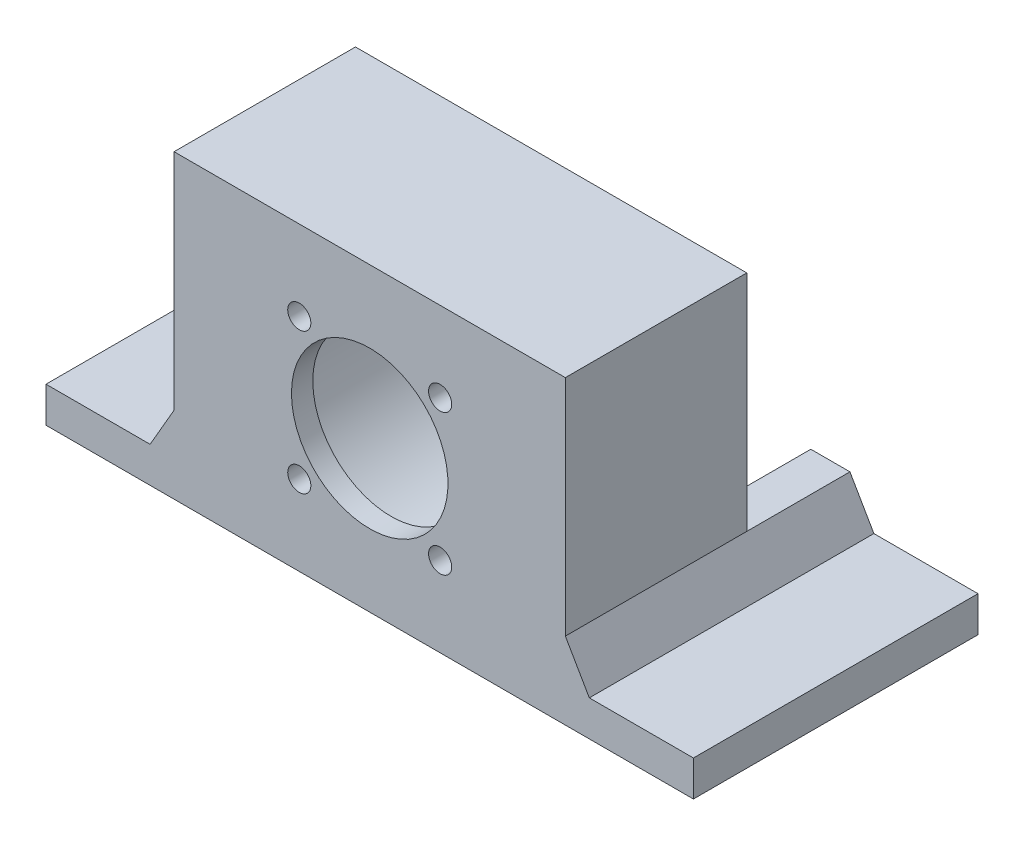
ISO-10303-21;
HEADER;
FILE_DESCRIPTION(('STEP AP214'),'2;1');
FILE_NAME('part.step','',(''),(''),'','','');
FILE_SCHEMA(('AUTOMOTIVE_DESIGN { 1 0 10303 214 1 1 1 1 }'));
ENDSEC;
DATA;
#1=APPLICATION_CONTEXT('core data for automotive mechanical design processes');
#2=APPLICATION_PROTOCOL_DEFINITION('international standard','automotive_design',2000,#1);
#3=PRODUCT_CONTEXT('',#1,'mechanical');
#4=PRODUCT('Part','Part','',(#3));
#5=PRODUCT_RELATED_PRODUCT_CATEGORY('part','',(#4));
#6=PRODUCT_DEFINITION_FORMATION('','',#4);
#7=PRODUCT_DEFINITION_CONTEXT('part definition',#1,'design');
#8=PRODUCT_DEFINITION('design','',#6,#7);
#9=PRODUCT_DEFINITION_SHAPE('','',#8);
#10=(LENGTH_UNIT() NAMED_UNIT(*) SI_UNIT(.MILLI.,.METRE.));
#11=(NAMED_UNIT(*) PLANE_ANGLE_UNIT() SI_UNIT($,.RADIAN.));
#12=(NAMED_UNIT(*) SI_UNIT($,.STERADIAN.) SOLID_ANGLE_UNIT());
#13=UNCERTAINTY_MEASURE_WITH_UNIT(LENGTH_MEASURE(1.E-05),#10,'distance_accuracy_value','');
#14=(GEOMETRIC_REPRESENTATION_CONTEXT(3) GLOBAL_UNCERTAINTY_ASSIGNED_CONTEXT((#13)) GLOBAL_UNIT_ASSIGNED_CONTEXT((#10,
#11,#12)) REPRESENTATION_CONTEXT('',''));
#15=CARTESIAN_POINT('',(0.,0.,0.));
#16=DIRECTION('',(0.,0.,1.));
#17=DIRECTION('',(1.,0.,0.));
#18=AXIS2_PLACEMENT_3D('',#15,#16,#17);
#19=CARTESIAN_POINT('',(0.,0.,0.));
#20=DIRECTION('',(0.,0.,-1.));
#21=DIRECTION('',(-1.,0.,0.));
#22=AXIS2_PLACEMENT_3D('',#19,#20,#21);
#23=PLANE('',#22);
#24=CARTESIAN_POINT('',(27.5,21.15,0.));
#25=DIRECTION('',(0.,0.,1.));
#26=DIRECTION('',(1.,0.,0.));
#27=AXIS2_PLACEMENT_3D('',#24,#25,#26);
#28=CIRCLE('',#27,18.1);
#29=CARTESIAN_POINT('',(45.6,21.15,0.));
#30=VERTEX_POINT('',#29);
#31=EDGE_CURVE('E305',#30,#30,#28,.T.);
#32=ORIENTED_EDGE('',*,*,#31,.T.);
#33=EDGE_LOOP('',(#32));
#34=FACE_BOUND('',#33,.T.);
#35=DIRECTION('',(1.,0.,0.));
#36=VECTOR('',#35,1.);
#37=CARTESIAN_POINT('',(0.,0.,0.));
#38=LINE('',#37,#36);
#39=CARTESIAN_POINT('',(5.5,0.,0.));
#40=VERTEX_POINT('',#39);
#41=CARTESIAN_POINT('',(49.5,0.,0.));
#42=VERTEX_POINT('',#41);
#43=EDGE_CURVE('E69',#40,#42,#38,.T.);
#44=ORIENTED_EDGE('',*,*,#43,.F.);
#45=DIRECTION('',(0.,-1.,0.));
#46=VECTOR('',#45,1.);
#47=CARTESIAN_POINT('',(5.5,10.8325274720935,0.));
#48=LINE('',#47,#46);
#49=CARTESIAN_POINT('',(5.5,10.8325274720935,0.));
#50=VERTEX_POINT('',#49);
#51=EDGE_CURVE('E64',#50,#40,#48,.T.);
#52=ORIENTED_EDGE('',*,*,#51,.F.);
#53=DIRECTION('',(1.,0.,0.));
#54=VECTOR('',#53,1.);
#55=CARTESIAN_POINT('',(0.,10.8325274720935,0.));
#56=LINE('',#55,#54);
#57=CARTESIAN_POINT('',(0.,10.8325274720935,0.));
#58=VERTEX_POINT('',#57);
#59=EDGE_CURVE('E173',#58,#50,#56,.T.);
#60=ORIENTED_EDGE('',*,*,#59,.F.);
#61=DIRECTION('',(0.,-1.,0.));
#62=VECTOR('',#61,1.);
#63=CARTESIAN_POINT('',(0.,0.,0.));
#64=LINE('',#63,#62);
#65=CARTESIAN_POINT('',(0.,42.3,0.));
#66=VERTEX_POINT('',#65);
#67=EDGE_CURVE('E314',#66,#58,#64,.T.);
#68=ORIENTED_EDGE('',*,*,#67,.F.);
#69=DIRECTION('',(-1.,0.,0.));
#70=VECTOR('',#69,1.);
#71=CARTESIAN_POINT('',(0.,42.3,0.));
#72=LINE('',#71,#70);
#73=CARTESIAN_POINT('',(55.,42.3,0.));
#74=VERTEX_POINT('',#73);
#75=EDGE_CURVE('E320',#74,#66,#72,.T.);
#76=ORIENTED_EDGE('',*,*,#75,.F.);
#77=DIRECTION('',(0.,1.,0.));
#78=VECTOR('',#77,1.);
#79=CARTESIAN_POINT('',(55.,0.,0.));
#80=LINE('',#79,#78);
#81=CARTESIAN_POINT('',(55.,10.8325274720935,0.));
#82=VERTEX_POINT('',#81);
#83=EDGE_CURVE('E335',#82,#74,#80,.T.);
#84=ORIENTED_EDGE('',*,*,#83,.F.);
#85=DIRECTION('',(1.,0.,0.));
#86=VECTOR('',#85,1.);
#87=CARTESIAN_POINT('',(55.,10.8325274720935,0.));
#88=LINE('',#87,#86);
#89=CARTESIAN_POINT('',(49.5,10.8325274720935,0.));
#90=VERTEX_POINT('',#89);
#91=EDGE_CURVE('E197',#90,#82,#88,.T.);
#92=ORIENTED_EDGE('',*,*,#91,.F.);
#93=DIRECTION('',(0.,1.,0.));
#94=VECTOR('',#93,1.);
#95=CARTESIAN_POINT('',(49.5,10.8325274720935,0.));
#96=LINE('',#95,#94);
#97=EDGE_CURVE('E193',#42,#90,#96,.T.);
#98=ORIENTED_EDGE('',*,*,#97,.F.);
#99=EDGE_LOOP('',(#44,#52,#60,#68,#76,#84,#92,#98));
#100=FACE_BOUND('',#99,.T.);
#101=ADVANCED_FACE('F45',(#34,#100),#23,.T.);
#102=CARTESIAN_POINT('',(55.,0.,25.5));
#103=DIRECTION('',(-1.,0.,0.));
#104=DIRECTION('',(0.,0.,1.));
#105=AXIS2_PLACEMENT_3D('',#102,#103,#104);
#106=PLANE('',#105);
#107=DIRECTION('',(0.,0.,1.));
#108=VECTOR('',#107,1.);
#109=CARTESIAN_POINT('',(55.,10.8325274720935,-14.5));
#110=LINE('',#109,#108);
#111=CARTESIAN_POINT('',(55.,10.8325274720935,25.5));
#112=VERTEX_POINT('',#111);
#113=EDGE_CURVE('E55',#82,#112,#110,.T.);
#114=ORIENTED_EDGE('',*,*,#113,.F.);
#115=ORIENTED_EDGE('',*,*,#83,.T.);
#116=DIRECTION('',(0.,0.,-1.));
#117=VECTOR('',#116,1.);
#118=CARTESIAN_POINT('',(55.,42.3,25.5));
#119=LINE('',#118,#117);
#120=CARTESIAN_POINT('',(55.,42.3,25.5));
#121=VERTEX_POINT('',#120);
#122=EDGE_CURVE('E343',#121,#74,#119,.T.);
#123=ORIENTED_EDGE('',*,*,#122,.F.);
#124=DIRECTION('',(0.,1.,0.));
#125=VECTOR('',#124,1.);
#126=CARTESIAN_POINT('',(55.,0.,25.5));
#127=LINE('',#126,#125);
#128=EDGE_CURVE('E323',#112,#121,#127,.T.);
#129=ORIENTED_EDGE('',*,*,#128,.F.);
#130=EDGE_LOOP('',(#114,#115,#123,#129));
#131=FACE_BOUND('',#130,.T.);
#132=ADVANCED_FACE('F421',(#131),#106,.F.);
#133=CARTESIAN_POINT('',(0.,0.,25.5));
#134=DIRECTION('',(1.,0.,0.));
#135=DIRECTION('',(0.,0.,-1.));
#136=AXIS2_PLACEMENT_3D('',#133,#134,#135);
#137=PLANE('',#136);
#138=ORIENTED_EDGE('',*,*,#67,.T.);
#139=DIRECTION('',(0.,0.,1.));
#140=VECTOR('',#139,1.);
#141=CARTESIAN_POINT('',(0.,10.8325274720935,-14.5));
#142=LINE('',#141,#140);
#143=CARTESIAN_POINT('',(0.,10.8325274720935,25.5));
#144=VERTEX_POINT('',#143);
#145=EDGE_CURVE('E12',#58,#144,#142,.T.);
#146=ORIENTED_EDGE('',*,*,#145,.T.);
#147=DIRECTION('',(0.,-1.,0.));
#148=VECTOR('',#147,1.);
#149=CARTESIAN_POINT('',(0.,0.,25.5));
#150=LINE('',#149,#148);
#151=CARTESIAN_POINT('',(0.,42.3,25.5));
#152=VERTEX_POINT('',#151);
#153=EDGE_CURVE('E315',#152,#144,#150,.T.);
#154=ORIENTED_EDGE('',*,*,#153,.F.);
#155=DIRECTION('',(0.,0.,-1.));
#156=VECTOR('',#155,1.);
#157=CARTESIAN_POINT('',(0.,42.3,25.5));
#158=LINE('',#157,#156);
#159=EDGE_CURVE('E329',#152,#66,#158,.T.);
#160=ORIENTED_EDGE('',*,*,#159,.T.);
#161=EDGE_LOOP('',(#138,#146,#154,#160));
#162=FACE_BOUND('',#161,.T.);
#163=ADVANCED_FACE('F47',(#162),#137,.F.);
#164=CARTESIAN_POINT('',(0.,0.,25.5));
#165=DIRECTION('',(0.,1.,0.));
#166=DIRECTION('',(0.,0.,1.));
#167=AXIS2_PLACEMENT_3D('',#164,#165,#166);
#168=PLANE('',#167);
#169=DIRECTION('',(0.,0.,1.));
#170=VECTOR('',#169,1.);
#171=CARTESIAN_POINT('',(5.5,0.,-26.6488127581942));
#172=LINE('',#171,#170);
#173=CARTESIAN_POINT('',(5.5,0.,-14.5));
#174=VERTEX_POINT('',#173);
#175=EDGE_CURVE('E176',#174,#40,#172,.T.);
#176=ORIENTED_EDGE('',*,*,#175,.T.);
#177=ORIENTED_EDGE('',*,*,#43,.T.);
#178=DIRECTION('',(0.,0.,1.));
#179=VECTOR('',#178,1.);
#180=CARTESIAN_POINT('',(49.5,0.,-26.6488127581942));
#181=LINE('',#180,#179);
#182=CARTESIAN_POINT('',(49.5,0.,-14.5));
#183=VERTEX_POINT('',#182);
#184=EDGE_CURVE('E188',#183,#42,#181,.T.);
#185=ORIENTED_EDGE('',*,*,#184,.F.);
#186=DIRECTION('',(1.,0.,0.));
#187=VECTOR('',#186,1.);
#188=CARTESIAN_POINT('',(55.,0.,-14.5));
#189=LINE('',#188,#187);
#190=CARTESIAN_POINT('',(73.,0.,-14.5));
#191=VERTEX_POINT('',#190);
#192=EDGE_CURVE('E244',#183,#191,#189,.T.);
#193=ORIENTED_EDGE('',*,*,#192,.T.);
#194=DIRECTION('',(0.,0.,1.));
#195=VECTOR('',#194,1.);
#196=CARTESIAN_POINT('',(73.,0.,-14.5));
#197=LINE('',#196,#195);
#198=CARTESIAN_POINT('',(73.,0.,25.5));
#199=VERTEX_POINT('',#198);
#200=EDGE_CURVE('E260',#191,#199,#197,.T.);
#201=ORIENTED_EDGE('',*,*,#200,.T.);
#202=DIRECTION('',(1.,0.,0.));
#203=VECTOR('',#202,1.);
#204=CARTESIAN_POINT('',(0.,0.,25.5));
#205=LINE('',#204,#203);
#206=CARTESIAN_POINT('',(-18.,0.,25.5));
#207=VERTEX_POINT('',#206);
#208=EDGE_CURVE('E319',#207,#199,#205,.T.);
#209=ORIENTED_EDGE('',*,*,#208,.F.);
#210=DIRECTION('',(0.,0.,1.));
#211=VECTOR('',#210,1.);
#212=CARTESIAN_POINT('',(-18.,0.,-14.5));
#213=LINE('',#212,#211);
#214=CARTESIAN_POINT('',(-18.,0.,-14.5));
#215=VERTEX_POINT('',#214);
#216=EDGE_CURVE('E192',#215,#207,#213,.T.);
#217=ORIENTED_EDGE('',*,*,#216,.F.);
#218=DIRECTION('',(1.,0.,0.));
#219=VECTOR('',#218,1.);
#220=CARTESIAN_POINT('',(0.,0.,-14.5));
#221=LINE('',#220,#219);
#222=EDGE_CURVE('E224',#215,#174,#221,.T.);
#223=ORIENTED_EDGE('',*,*,#222,.T.);
#224=EDGE_LOOP('',(#176,#177,#185,#193,#201,#209,#217,#223));
#225=FACE_BOUND('',#224,.T.);
#226=ADVANCED_FACE('F405',(#225),#168,.F.);
#227=CARTESIAN_POINT('',(0.,42.3,25.5));
#228=DIRECTION('',(0.,-1.,0.));
#229=DIRECTION('',(0.,0.,-1.));
#230=AXIS2_PLACEMENT_3D('',#227,#228,#229);
#231=PLANE('',#230);
#232=ORIENTED_EDGE('',*,*,#75,.T.);
#233=ORIENTED_EDGE('',*,*,#159,.F.);
#234=DIRECTION('',(-1.,0.,0.));
#235=VECTOR('',#234,1.);
#236=CARTESIAN_POINT('',(0.,42.3,25.5));
#237=LINE('',#236,#235);
#238=EDGE_CURVE('E326',#121,#152,#237,.T.);
#239=ORIENTED_EDGE('',*,*,#238,.F.);
#240=ORIENTED_EDGE('',*,*,#122,.T.);
#241=EDGE_LOOP('',(#232,#233,#239,#240));
#242=FACE_BOUND('',#241,.T.);
#243=ADVANCED_FACE('F379',(#242),#231,.F.);
#244=CARTESIAN_POINT('',(0.,0.,25.5));
#245=DIRECTION('',(0.,0.,-1.));
#246=DIRECTION('',(-1.,0.,0.));
#247=AXIS2_PLACEMENT_3D('',#244,#245,#246);
#248=PLANE('',#247);
#249=CARTESIAN_POINT('',(37.3994949366116,11.2505050633883,25.5));
#250=DIRECTION('',(0.,0.,-1.));
#251=DIRECTION('',(-1.,0.,0.));
#252=AXIS2_PLACEMENT_3D('',#249,#250,#251);
#253=CIRCLE('',#252,1.62500000000006);
#254=CARTESIAN_POINT('',(35.7744949366116,11.2505050633883,25.5));
#255=VERTEX_POINT('',#254);
#256=EDGE_CURVE('E275',#255,#255,#253,.T.);
#257=ORIENTED_EDGE('',*,*,#256,.T.);
#258=EDGE_LOOP('',(#257));
#259=FACE_BOUND('',#258,.T.);
#260=CARTESIAN_POINT('',(17.6005050633883,11.2505050633884,25.5));
#261=DIRECTION('',(0.,0.,-1.));
#262=DIRECTION('',(-1.,0.,0.));
#263=AXIS2_PLACEMENT_3D('',#260,#261,#262);
#264=CIRCLE('',#263,1.62500000000001);
#265=CARTESIAN_POINT('',(15.9755050633883,11.2505050633884,25.5));
#266=VERTEX_POINT('',#265);
#267=EDGE_CURVE('E290',#266,#266,#264,.T.);
#268=ORIENTED_EDGE('',*,*,#267,.T.);
#269=EDGE_LOOP('',(#268));
#270=FACE_BOUND('',#269,.T.);
#271=CARTESIAN_POINT('',(17.6005050633884,31.0494949366117,25.5));
#272=DIRECTION('',(0.,0.,-1.));
#273=DIRECTION('',(-1.,0.,0.));
#274=AXIS2_PLACEMENT_3D('',#271,#272,#273);
#275=CIRCLE('',#274,1.62500000000001);
#276=CARTESIAN_POINT('',(15.9755050633884,31.0494949366117,25.5));
#277=VERTEX_POINT('',#276);
#278=EDGE_CURVE('E285',#277,#277,#275,.T.);
#279=ORIENTED_EDGE('',*,*,#278,.T.);
#280=EDGE_LOOP('',(#279));
#281=FACE_BOUND('',#280,.T.);
#282=CARTESIAN_POINT('',(37.3994949366117,31.0494949366116,25.5));
#283=DIRECTION('',(0.,0.,-1.));
#284=DIRECTION('',(-1.,0.,0.));
#285=AXIS2_PLACEMENT_3D('',#282,#283,#284);
#286=CIRCLE('',#285,1.62500000000001);
#287=CARTESIAN_POINT('',(35.7744949366117,31.0494949366116,25.5));
#288=VERTEX_POINT('',#287);
#289=EDGE_CURVE('E289',#288,#288,#286,.T.);
#290=ORIENTED_EDGE('',*,*,#289,.T.);
#291=EDGE_LOOP('',(#290));
#292=FACE_BOUND('',#291,.T.);
#293=CARTESIAN_POINT('',(27.5,21.15,25.5));
#294=DIRECTION('',(0.,0.,-1.));
#295=DIRECTION('',(-1.,0.,0.));
#296=AXIS2_PLACEMENT_3D('',#293,#294,#295);
#297=CIRCLE('',#296,11.);
#298=CARTESIAN_POINT('',(16.5,21.15,25.5));
#299=VERTEX_POINT('',#298);
#300=EDGE_CURVE('E301',#299,#299,#297,.T.);
#301=ORIENTED_EDGE('',*,*,#300,.T.);
#302=EDGE_LOOP('',(#301));
#303=FACE_BOUND('',#302,.T.);
#304=ORIENTED_EDGE('',*,*,#153,.T.);
#305=DIRECTION('',(-0.500000000000001,-0.866025403784438,0.));
#306=VECTOR('',#305,1.);
#307=CARTESIAN_POINT('',(0.,10.8325274720935,25.5));
#308=LINE('',#307,#306);
#309=CARTESIAN_POINT('',(-3.3674113060691,5.,25.5));
#310=VERTEX_POINT('',#309);
#311=EDGE_CURVE('E228',#144,#310,#308,.T.);
#312=ORIENTED_EDGE('',*,*,#311,.T.);
#313=DIRECTION('',(-1.,0.,0.));
#314=VECTOR('',#313,1.);
#315=CARTESIAN_POINT('',(-18.,5.,25.5));
#316=LINE('',#315,#314);
#317=CARTESIAN_POINT('',(-18.,5.,25.5));
#318=VERTEX_POINT('',#317);
#319=EDGE_CURVE('E223',#310,#318,#316,.T.);
#320=ORIENTED_EDGE('',*,*,#319,.T.);
#321=DIRECTION('',(0.,-1.,0.));
#322=VECTOR('',#321,1.);
#323=CARTESIAN_POINT('',(-18.,0.,25.5));
#324=LINE('',#323,#322);
#325=EDGE_CURVE('E219',#318,#207,#324,.T.);
#326=ORIENTED_EDGE('',*,*,#325,.T.);
#327=ORIENTED_EDGE('',*,*,#208,.T.);
#328=DIRECTION('',(0.,1.,0.));
#329=VECTOR('',#328,1.);
#330=CARTESIAN_POINT('',(73.,0.,25.5));
#331=LINE('',#330,#329);
#332=CARTESIAN_POINT('',(73.,5.,25.5));
#333=VERTEX_POINT('',#332);
#334=EDGE_CURVE('E232',#199,#333,#331,.T.);
#335=ORIENTED_EDGE('',*,*,#334,.T.);
#336=DIRECTION('',(-1.,0.,0.));
#337=VECTOR('',#336,1.);
#338=CARTESIAN_POINT('',(73.,5.,25.5));
#339=LINE('',#338,#337);
#340=CARTESIAN_POINT('',(58.3674113060691,5.,25.5));
#341=VERTEX_POINT('',#340);
#342=EDGE_CURVE('E264',#333,#341,#339,.T.);
#343=ORIENTED_EDGE('',*,*,#342,.T.);
#344=DIRECTION('',(-0.500000000000001,0.866025403784438,0.));
#345=VECTOR('',#344,1.);
#346=CARTESIAN_POINT('',(55.,10.8325274720935,25.5));
#347=LINE('',#346,#345);
#348=EDGE_CURVE('E249',#341,#112,#347,.T.);
#349=ORIENTED_EDGE('',*,*,#348,.T.);
#350=ORIENTED_EDGE('',*,*,#128,.T.);
#351=ORIENTED_EDGE('',*,*,#238,.T.);
#352=EDGE_LOOP('',(#304,#312,#320,#326,#327,#335,#343,#349,#350,#351));
#353=FACE_BOUND('',#352,.T.);
#354=ADVANCED_FACE('F375',(#259,#270,#281,#292,#303,#353),#248,.F.);
#355=CARTESIAN_POINT('',(27.5,21.15,76.6945309579061));
#356=DIRECTION('',(0.,0.,-1.));
#357=DIRECTION('',(-1.,0.,0.));
#358=AXIS2_PLACEMENT_3D('',#355,#356,#357);
#359=CYLINDRICAL_SURFACE('',#358,18.1);
#360=CARTESIAN_POINT('',(27.5,21.15,22.5));
#361=DIRECTION('',(0.,0.,-1.));
#362=DIRECTION('',(-1.,0.,0.));
#363=AXIS2_PLACEMENT_3D('',#360,#361,#362);
#364=CIRCLE('',#363,18.1);
#365=CARTESIAN_POINT('',(9.4,21.15,22.5));
#366=VERTEX_POINT('',#365);
#367=EDGE_CURVE('E310',#366,#366,#364,.T.);
#368=ORIENTED_EDGE('',*,*,#367,.F.);
#369=EDGE_LOOP('',(#368));
#370=FACE_BOUND('',#369,.T.);
#371=ORIENTED_EDGE('',*,*,#31,.F.);
#372=EDGE_LOOP('',(#371));
#373=FACE_BOUND('',#372,.T.);
#374=ADVANCED_FACE('F378',(#370,#373),#359,.F.);
#375=CARTESIAN_POINT('',(0.,0.,22.5));
#376=DIRECTION('',(0.,0.,-1.));
#377=DIRECTION('',(-1.,0.,0.));
#378=AXIS2_PLACEMENT_3D('',#375,#376,#377);
#379=PLANE('',#378);
#380=CARTESIAN_POINT('',(37.3994949366116,11.2505050633883,22.5));
#381=DIRECTION('',(0.,0.,-1.));
#382=DIRECTION('',(-1.,0.,0.));
#383=AXIS2_PLACEMENT_3D('',#380,#381,#382);
#384=CIRCLE('',#383,1.62500000000006);
#385=CARTESIAN_POINT('',(35.7744949366116,11.2505050633883,22.5));
#386=VERTEX_POINT('',#385);
#387=EDGE_CURVE('E49',#386,#386,#384,.F.);
#388=ORIENTED_EDGE('',*,*,#387,.T.);
#389=EDGE_LOOP('',(#388));
#390=FACE_BOUND('',#389,.T.);
#391=CARTESIAN_POINT('',(17.6005050633883,11.2505050633884,22.5));
#392=DIRECTION('',(0.,0.,-1.));
#393=DIRECTION('',(-1.,0.,0.));
#394=AXIS2_PLACEMENT_3D('',#391,#392,#393);
#395=CIRCLE('',#394,1.62500000000001);
#396=CARTESIAN_POINT('',(15.9755050633883,11.2505050633884,22.5));
#397=VERTEX_POINT('',#396);
#398=EDGE_CURVE('E356',#397,#397,#395,.F.);
#399=ORIENTED_EDGE('',*,*,#398,.T.);
#400=EDGE_LOOP('',(#399));
#401=FACE_BOUND('',#400,.T.);
#402=CARTESIAN_POINT('',(17.6005050633884,31.0494949366117,22.5));
#403=DIRECTION('',(0.,0.,-1.));
#404=DIRECTION('',(-1.,0.,0.));
#405=AXIS2_PLACEMENT_3D('',#402,#403,#404);
#406=CIRCLE('',#405,1.62500000000001);
#407=CARTESIAN_POINT('',(15.9755050633884,31.0494949366117,22.5));
#408=VERTEX_POINT('',#407);
#409=EDGE_CURVE('E353',#408,#408,#406,.F.);
#410=ORIENTED_EDGE('',*,*,#409,.T.);
#411=EDGE_LOOP('',(#410));
#412=FACE_BOUND('',#411,.T.);
#413=CARTESIAN_POINT('',(37.3994949366117,31.0494949366116,22.5));
#414=DIRECTION('',(0.,0.,-1.));
#415=DIRECTION('',(-1.,0.,0.));
#416=AXIS2_PLACEMENT_3D('',#413,#414,#415);
#417=CIRCLE('',#416,1.62500000000001);
#418=CARTESIAN_POINT('',(35.7744949366117,31.0494949366116,22.5));
#419=VERTEX_POINT('',#418);
#420=EDGE_CURVE('E300',#419,#419,#417,.F.);
#421=ORIENTED_EDGE('',*,*,#420,.T.);
#422=EDGE_LOOP('',(#421));
#423=FACE_BOUND('',#422,.T.);
#424=CARTESIAN_POINT('',(27.5,21.15,22.5));
#425=DIRECTION('',(0.,0.,-1.));
#426=DIRECTION('',(-1.,0.,0.));
#427=AXIS2_PLACEMENT_3D('',#424,#425,#426);
#428=CIRCLE('',#427,11.);
#429=CARTESIAN_POINT('',(16.5,21.15,22.5));
#430=VERTEX_POINT('',#429);
#431=EDGE_CURVE('E306',#430,#430,#428,.T.);
#432=ORIENTED_EDGE('',*,*,#431,.F.);
#433=EDGE_LOOP('',(#432));
#434=FACE_BOUND('',#433,.T.);
#435=ORIENTED_EDGE('',*,*,#367,.T.);
#436=EDGE_LOOP('',(#435));
#437=FACE_BOUND('',#436,.T.);
#438=ADVANCED_FACE('F365',(#390,#401,#412,#423,#434,#437),#379,.T.);
#439=CARTESIAN_POINT('',(27.5,21.15,25.500012));
#440=DIRECTION('',(0.,0.,-1.));
#441=DIRECTION('',(-1.,0.,0.));
#442=AXIS2_PLACEMENT_3D('',#439,#440,#441);
#443=CYLINDRICAL_SURFACE('',#442,11.);
#444=CARTESIAN_POINT('',(16.5,21.15,22.5));
#445=CARTESIAN_POINT('',(16.5,21.15,22.53125));
#446=CARTESIAN_POINT('',(16.5,21.15,22.5625));
#447=CARTESIAN_POINT('',(16.5,21.15,22.625));
#448=CARTESIAN_POINT('',(16.5,21.15,22.65625));
#449=CARTESIAN_POINT('',(16.5,21.15,22.71875));
#450=CARTESIAN_POINT('',(16.5,21.15,22.75));
#451=CARTESIAN_POINT('',(16.5,21.15,22.8125));
#452=CARTESIAN_POINT('',(16.5,21.15,22.84375));
#453=CARTESIAN_POINT('',(16.5,21.15,22.90625));
#454=CARTESIAN_POINT('',(16.5,21.15,22.9375));
#455=CARTESIAN_POINT('',(16.5,21.15,23.));
#456=CARTESIAN_POINT('',(16.5,21.15,23.03125));
#457=CARTESIAN_POINT('',(16.5,21.15,23.09375));
#458=CARTESIAN_POINT('',(16.5,21.15,23.125));
#459=CARTESIAN_POINT('',(16.5,21.15,23.1875));
#460=CARTESIAN_POINT('',(16.5,21.15,23.21875));
#461=CARTESIAN_POINT('',(16.5,21.15,23.28125));
#462=CARTESIAN_POINT('',(16.5,21.15,23.3125));
#463=CARTESIAN_POINT('',(16.5,21.15,23.375));
#464=CARTESIAN_POINT('',(16.5,21.15,23.40625));
#465=CARTESIAN_POINT('',(16.5,21.15,23.46875));
#466=CARTESIAN_POINT('',(16.5,21.15,23.5));
#467=CARTESIAN_POINT('',(16.5,21.15,23.5625));
#468=CARTESIAN_POINT('',(16.5,21.15,23.59375));
#469=CARTESIAN_POINT('',(16.5,21.15,23.65625));
#470=CARTESIAN_POINT('',(16.5,21.15,23.6875));
#471=CARTESIAN_POINT('',(16.5,21.15,23.75));
#472=CARTESIAN_POINT('',(16.5,21.15,23.78125));
#473=CARTESIAN_POINT('',(16.5,21.15,23.84375));
#474=CARTESIAN_POINT('',(16.5,21.15,23.875));
#475=CARTESIAN_POINT('',(16.5,21.15,23.9375));
#476=CARTESIAN_POINT('',(16.5,21.15,23.96875));
#477=CARTESIAN_POINT('',(16.5,21.15,24.03125));
#478=CARTESIAN_POINT('',(16.5,21.15,24.0625));
#479=CARTESIAN_POINT('',(16.5,21.15,24.125));
#480=CARTESIAN_POINT('',(16.5,21.15,24.15625));
#481=CARTESIAN_POINT('',(16.5,21.15,24.21875));
#482=CARTESIAN_POINT('',(16.5,21.15,24.25));
#483=CARTESIAN_POINT('',(16.5,21.15,24.3125));
#484=CARTESIAN_POINT('',(16.5,21.15,24.34375));
#485=CARTESIAN_POINT('',(16.5,21.15,24.40625));
#486=CARTESIAN_POINT('',(16.5,21.15,24.4375));
#487=CARTESIAN_POINT('',(16.5,21.15,24.5));
#488=CARTESIAN_POINT('',(16.5,21.15,24.53125));
#489=CARTESIAN_POINT('',(16.5,21.15,24.59375));
#490=CARTESIAN_POINT('',(16.5,21.15,24.625));
#491=CARTESIAN_POINT('',(16.5,21.15,24.6875));
#492=CARTESIAN_POINT('',(16.5,21.15,24.71875));
#493=CARTESIAN_POINT('',(16.5,21.15,24.78125));
#494=CARTESIAN_POINT('',(16.5,21.15,24.8125));
#495=CARTESIAN_POINT('',(16.5,21.15,24.875));
#496=CARTESIAN_POINT('',(16.5,21.15,24.90625));
#497=CARTESIAN_POINT('',(16.5,21.15,24.96875));
#498=CARTESIAN_POINT('',(16.5,21.15,25.));
#499=CARTESIAN_POINT('',(16.5,21.15,25.0625));
#500=CARTESIAN_POINT('',(16.5,21.15,25.09375));
#501=CARTESIAN_POINT('',(16.5,21.15,25.15625));
#502=CARTESIAN_POINT('',(16.5,21.15,25.1875));
#503=CARTESIAN_POINT('',(16.5,21.15,25.25));
#504=CARTESIAN_POINT('',(16.5,21.15,25.28125));
#505=CARTESIAN_POINT('',(16.5,21.15,25.34375));
#506=CARTESIAN_POINT('',(16.5,21.15,25.375));
#507=CARTESIAN_POINT('',(16.5,21.15,25.4375));
#508=CARTESIAN_POINT('',(16.5,21.15,25.46875));
#509=CARTESIAN_POINT('',(16.5,21.15,25.5));
#510=B_SPLINE_CURVE_WITH_KNOTS('',3,(#444,#445,#446,#447,#448,#449,#450,#451,#452,#453,#454,
#455,#456,#457,#458,#459,#460,#461,#462,#463,#464,#465,#466,#467,#468,#469,#470,#471,#472,#473,
#474,#475,#476,#477,#478,#479,#480,#481,#482,#483,#484,#485,#486,#487,#488,#489,#490,#491,#492,
#493,#494,#495,#496,#497,#498,#499,#500,#501,#502,#503,#504,#505,#506,#507,#508,#509),
.UNSPECIFIED.,.F.,.F.,(4,2,2,2,2,2,2,2,2,2,2,2,2,2,2,2,2,2,2,2,2,2,2,2,2,2,2,2,2,2,2,2,4),(0.,
0.0937500000000001,0.1875,0.28125,0.374999999999997,0.46875,0.562499999999997,0.656249999999997,
0.749999999999997,0.843749999999997,0.937499999999997,1.03125,1.125,1.21875,1.3125,1.40625,1.5,
1.59375,1.6875,1.78125,1.875,1.96875,2.0625,2.15625,2.25,2.34375,2.4375,2.53125,2.625,2.71875,
2.8125,2.90625,3.),.UNSPECIFIED.);
#511=EDGE_CURVE('BSEAM564',#430,#299,#510,.T.);
#512=ORIENTED_EDGE('',*,*,#431,.T.);
#513=ORIENTED_EDGE('',*,*,#300,.F.);
#514=ORIENTED_EDGE('',*,*,#511,.T.);
#515=ORIENTED_EDGE('',*,*,#511,.F.);
#516=EDGE_LOOP('',(#512,#514,#513,#515));
#517=FACE_BOUND('',#516,.T.);
#518=ADVANCED_FACE('F564',(#517),#443,.F.);
#519=CARTESIAN_POINT('',(37.3994949366117,31.0494949366116,15.5));
#520=DIRECTION('',(0.,0.,1.));
#521=DIRECTION('',(1.,0.,0.));
#522=AXIS2_PLACEMENT_3D('',#519,#520,#521);
#523=CYLINDRICAL_SURFACE('',#522,1.62500000000001);
#524=ORIENTED_EDGE('',*,*,#420,.F.);
#525=EDGE_LOOP('',(#524));
#526=FACE_BOUND('',#525,.T.);
#527=ORIENTED_EDGE('',*,*,#289,.F.);
#528=EDGE_LOOP('',(#527));
#529=FACE_BOUND('',#528,.T.);
#530=ADVANCED_FACE('F553',(#526,#529),#523,.F.);
#531=CARTESIAN_POINT('',(17.6005050633884,31.0494949366117,15.5));
#532=DIRECTION('',(0.,0.,1.));
#533=DIRECTION('',(1.,0.,0.));
#534=AXIS2_PLACEMENT_3D('',#531,#532,#533);
#535=CYLINDRICAL_SURFACE('',#534,1.62500000000001);
#536=ORIENTED_EDGE('',*,*,#409,.F.);
#537=EDGE_LOOP('',(#536));
#538=FACE_BOUND('',#537,.T.);
#539=ORIENTED_EDGE('',*,*,#278,.F.);
#540=EDGE_LOOP('',(#539));
#541=FACE_BOUND('',#540,.T.);
#542=ADVANCED_FACE('F542',(#538,#541),#535,.F.);
#543=CARTESIAN_POINT('',(17.6005050633883,11.2505050633884,15.5));
#544=DIRECTION('',(0.,0.,1.));
#545=DIRECTION('',(1.,0.,0.));
#546=AXIS2_PLACEMENT_3D('',#543,#544,#545);
#547=CYLINDRICAL_SURFACE('',#546,1.62500000000001);
#548=ORIENTED_EDGE('',*,*,#398,.F.);
#549=EDGE_LOOP('',(#548));
#550=FACE_BOUND('',#549,.T.);
#551=ORIENTED_EDGE('',*,*,#267,.F.);
#552=EDGE_LOOP('',(#551));
#553=FACE_BOUND('',#552,.T.);
#554=ADVANCED_FACE('F371',(#550,#553),#547,.F.);
#555=CARTESIAN_POINT('',(37.3994949366116,11.2505050633883,15.5));
#556=DIRECTION('',(0.,0.,1.));
#557=DIRECTION('',(1.,0.,0.));
#558=AXIS2_PLACEMENT_3D('',#555,#556,#557);
#559=CYLINDRICAL_SURFACE('',#558,1.62500000000006);
#560=ORIENTED_EDGE('',*,*,#387,.F.);
#561=EDGE_LOOP('',(#560));
#562=FACE_BOUND('',#561,.T.);
#563=ORIENTED_EDGE('',*,*,#256,.F.);
#564=EDGE_LOOP('',(#563));
#565=FACE_BOUND('',#564,.T.);
#566=ADVANCED_FACE('F367',(#562,#565),#559,.F.);
#567=CARTESIAN_POINT('',(55.,10.8325274720935,-14.5));
#568=DIRECTION('',(0.866025403784438,0.500000000000001,0.));
#569=DIRECTION('',(-0.500000000000001,0.866025403784438,0.));
#570=AXIS2_PLACEMENT_3D('',#567,#568,#569);
#571=PLANE('',#570);
#572=ORIENTED_EDGE('',*,*,#348,.F.);
#573=DIRECTION('',(0.,0.,1.));
#574=VECTOR('',#573,1.);
#575=CARTESIAN_POINT('',(58.3674113060691,5.,-14.5));
#576=LINE('',#575,#574);
#577=CARTESIAN_POINT('',(58.3674113060691,5.,-14.5));
#578=VERTEX_POINT('',#577);
#579=EDGE_CURVE('E276',#578,#341,#576,.T.);
#580=ORIENTED_EDGE('',*,*,#579,.F.);
#581=DIRECTION('',(-0.500000000000001,0.866025403784438,0.));
#582=VECTOR('',#581,1.);
#583=CARTESIAN_POINT('',(55.,10.8325274720935,-14.5));
#584=LINE('',#583,#582);
#585=CARTESIAN_POINT('',(55.,10.8325274720935,-14.5));
#586=VERTEX_POINT('',#585);
#587=EDGE_CURVE('E257',#578,#586,#584,.T.);
#588=ORIENTED_EDGE('',*,*,#587,.T.);
#589=EDGE_CURVE('E271',#586,#82,#110,.T.);
#590=ORIENTED_EDGE('',*,*,#589,.T.);
#591=ORIENTED_EDGE('',*,*,#113,.T.);
#592=EDGE_LOOP('',(#572,#580,#588,#590,#591));
#593=FACE_BOUND('',#592,.T.);
#594=ADVANCED_FACE('F370',(#593),#571,.T.);
#595=CARTESIAN_POINT('',(73.,5.,-14.5));
#596=DIRECTION('',(0.,1.,0.));
#597=DIRECTION('',(-1.,0.,0.));
#598=AXIS2_PLACEMENT_3D('',#595,#596,#597);
#599=PLANE('',#598);
#600=ORIENTED_EDGE('',*,*,#342,.F.);
#601=DIRECTION('',(0.,0.,1.));
#602=VECTOR('',#601,1.);
#603=CARTESIAN_POINT('',(73.,5.,-14.5));
#604=LINE('',#603,#602);
#605=CARTESIAN_POINT('',(73.,5.,-14.5));
#606=VERTEX_POINT('',#605);
#607=EDGE_CURVE('E279',#606,#333,#604,.T.);
#608=ORIENTED_EDGE('',*,*,#607,.F.);
#609=DIRECTION('',(-1.,0.,0.));
#610=VECTOR('',#609,1.);
#611=CARTESIAN_POINT('',(73.,5.,-14.5));
#612=LINE('',#611,#610);
#613=EDGE_CURVE('E253',#606,#578,#612,.T.);
#614=ORIENTED_EDGE('',*,*,#613,.T.);
#615=ORIENTED_EDGE('',*,*,#579,.T.);
#616=EDGE_LOOP('',(#600,#608,#614,#615));
#617=FACE_BOUND('',#616,.T.);
#618=ADVANCED_FACE('F414',(#617),#599,.T.);
#619=CARTESIAN_POINT('',(73.,0.,-14.5));
#620=DIRECTION('',(1.,0.,0.));
#621=DIRECTION('',(0.,1.,0.));
#622=AXIS2_PLACEMENT_3D('',#619,#620,#621);
#623=PLANE('',#622);
#624=ORIENTED_EDGE('',*,*,#334,.F.);
#625=ORIENTED_EDGE('',*,*,#200,.F.);
#626=DIRECTION('',(0.,1.,0.));
#627=VECTOR('',#626,1.);
#628=CARTESIAN_POINT('',(73.,0.,-14.5));
#629=LINE('',#628,#627);
#630=EDGE_CURVE('E248',#191,#606,#629,.T.);
#631=ORIENTED_EDGE('',*,*,#630,.T.);
#632=ORIENTED_EDGE('',*,*,#607,.T.);
#633=EDGE_LOOP('',(#624,#625,#631,#632));
#634=FACE_BOUND('',#633,.T.);
#635=ADVANCED_FACE('F410',(#634),#623,.T.);
#636=CARTESIAN_POINT('',(0.,0.,-14.5));
#637=DIRECTION('',(0.,0.,1.));
#638=DIRECTION('',(1.,0.,0.));
#639=AXIS2_PLACEMENT_3D('',#636,#637,#638);
#640=PLANE('',#639);
#641=ORIENTED_EDGE('',*,*,#192,.F.);
#642=DIRECTION('',(0.,-1.,0.));
#643=VECTOR('',#642,1.);
#644=CARTESIAN_POINT('',(49.5,10.8325274720935,-14.5));
#645=LINE('',#644,#643);
#646=CARTESIAN_POINT('',(49.5,10.8325274720935,-14.5));
#647=VERTEX_POINT('',#646);
#648=EDGE_CURVE('E187',#647,#183,#645,.T.);
#649=ORIENTED_EDGE('',*,*,#648,.F.);
#650=DIRECTION('',(-1.,0.,0.));
#651=VECTOR('',#650,1.);
#652=CARTESIAN_POINT('',(55.,10.8325274720935,-14.5));
#653=LINE('',#652,#651);
#654=EDGE_CURVE('E183',#586,#647,#653,.T.);
#655=ORIENTED_EDGE('',*,*,#654,.F.);
#656=ORIENTED_EDGE('',*,*,#587,.F.);
#657=ORIENTED_EDGE('',*,*,#613,.F.);
#658=ORIENTED_EDGE('',*,*,#630,.F.);
#659=EDGE_LOOP('',(#641,#649,#655,#656,#657,#658));
#660=FACE_BOUND('',#659,.T.);
#661=ADVANCED_FACE('F435',(#660),#640,.F.);
#662=CARTESIAN_POINT('',(-18.,0.,-14.5));
#663=DIRECTION('',(-1.,0.,0.));
#664=DIRECTION('',(0.,-1.,0.));
#665=AXIS2_PLACEMENT_3D('',#662,#663,#664);
#666=PLANE('',#665);
#667=ORIENTED_EDGE('',*,*,#325,.F.);
#668=DIRECTION('',(0.,0.,1.));
#669=VECTOR('',#668,1.);
#670=CARTESIAN_POINT('',(-18.,5.,-14.5));
#671=LINE('',#670,#669);
#672=CARTESIAN_POINT('',(-18.,5.,-14.5));
#673=VERTEX_POINT('',#672);
#674=EDGE_CURVE('E213',#673,#318,#671,.T.);
#675=ORIENTED_EDGE('',*,*,#674,.F.);
#676=DIRECTION('',(0.,-1.,0.));
#677=VECTOR('',#676,1.);
#678=CARTESIAN_POINT('',(-18.,0.,-14.5));
#679=LINE('',#678,#677);
#680=EDGE_CURVE('E209',#673,#215,#679,.T.);
#681=ORIENTED_EDGE('',*,*,#680,.T.);
#682=ORIENTED_EDGE('',*,*,#216,.T.);
#683=EDGE_LOOP('',(#667,#675,#681,#682));
#684=FACE_BOUND('',#683,.T.);
#685=ADVANCED_FACE('F402',(#684),#666,.T.);
#686=CARTESIAN_POINT('',(-18.,5.,-14.5));
#687=DIRECTION('',(0.,1.,0.));
#688=DIRECTION('',(-1.,0.,0.));
#689=AXIS2_PLACEMENT_3D('',#686,#687,#688);
#690=PLANE('',#689);
#691=ORIENTED_EDGE('',*,*,#319,.F.);
#692=DIRECTION('',(0.,0.,1.));
#693=VECTOR('',#692,1.);
#694=CARTESIAN_POINT('',(-3.3674113060691,5.,-14.5));
#695=LINE('',#694,#693);
#696=CARTESIAN_POINT('',(-3.3674113060691,5.,-14.5));
#697=VERTEX_POINT('',#696);
#698=EDGE_CURVE('E210',#697,#310,#695,.T.);
#699=ORIENTED_EDGE('',*,*,#698,.F.);
#700=DIRECTION('',(-1.,0.,0.));
#701=VECTOR('',#700,1.);
#702=CARTESIAN_POINT('',(-18.,5.,-14.5));
#703=LINE('',#702,#701);
#704=EDGE_CURVE('E236',#697,#673,#703,.T.);
#705=ORIENTED_EDGE('',*,*,#704,.T.);
#706=ORIENTED_EDGE('',*,*,#674,.T.);
#707=EDGE_LOOP('',(#691,#699,#705,#706));
#708=FACE_BOUND('',#707,.T.);
#709=ADVANCED_FACE('F399',(#708),#690,.T.);
#710=CARTESIAN_POINT('',(0.,10.8325274720935,-14.5));
#711=DIRECTION('',(-0.866025403784438,0.500000000000001,0.));
#712=DIRECTION('',(-0.500000000000001,-0.866025403784438,0.));
#713=AXIS2_PLACEMENT_3D('',#710,#711,#712);
#714=PLANE('',#713);
#715=ORIENTED_EDGE('',*,*,#311,.F.);
#716=ORIENTED_EDGE('',*,*,#145,.F.);
#717=CARTESIAN_POINT('',(0.,10.8325274720935,-14.5));
#718=VERTEX_POINT('',#717);
#719=EDGE_CURVE('E57',#718,#58,#142,.T.);
#720=ORIENTED_EDGE('',*,*,#719,.F.);
#721=DIRECTION('',(-0.500000000000001,-0.866025403784438,0.));
#722=VECTOR('',#721,1.);
#723=CARTESIAN_POINT('',(0.,10.8325274720935,-14.5));
#724=LINE('',#723,#722);
#725=EDGE_CURVE('E164',#718,#697,#724,.T.);
#726=ORIENTED_EDGE('',*,*,#725,.T.);
#727=ORIENTED_EDGE('',*,*,#698,.T.);
#728=EDGE_LOOP('',(#715,#716,#720,#726,#727));
#729=FACE_BOUND('',#728,.T.);
#730=ADVANCED_FACE('F396',(#729),#714,.T.);
#731=CARTESIAN_POINT('',(0.,0.,-14.5));
#732=DIRECTION('',(0.,0.,-1.));
#733=DIRECTION('',(-1.,0.,0.));
#734=AXIS2_PLACEMENT_3D('',#731,#732,#733);
#735=PLANE('',#734);
#736=ORIENTED_EDGE('',*,*,#222,.F.);
#737=ORIENTED_EDGE('',*,*,#680,.F.);
#738=ORIENTED_EDGE('',*,*,#704,.F.);
#739=ORIENTED_EDGE('',*,*,#725,.F.);
#740=DIRECTION('',(-1.,0.,0.));
#741=VECTOR('',#740,1.);
#742=CARTESIAN_POINT('',(0.,10.8325274720935,-14.5));
#743=LINE('',#742,#741);
#744=CARTESIAN_POINT('',(5.5,10.8325274720935,-14.5));
#745=VERTEX_POINT('',#744);
#746=EDGE_CURVE('E155',#745,#718,#743,.T.);
#747=ORIENTED_EDGE('',*,*,#746,.F.);
#748=DIRECTION('',(0.,1.,0.));
#749=VECTOR('',#748,1.);
#750=CARTESIAN_POINT('',(5.5,10.8325274720935,-14.5));
#751=LINE('',#750,#749);
#752=EDGE_CURVE('E160',#174,#745,#751,.T.);
#753=ORIENTED_EDGE('',*,*,#752,.F.);
#754=EDGE_LOOP('',(#736,#737,#738,#739,#747,#753));
#755=FACE_BOUND('',#754,.T.);
#756=ADVANCED_FACE('F158',(#755),#735,.T.);
#757=CARTESIAN_POINT('',(55.,10.8325274720935,-26.6488127581942));
#758=DIRECTION('',(0.,-1.,0.));
#759=DIRECTION('',(0.,0.,-1.));
#760=AXIS2_PLACEMENT_3D('',#757,#758,#759);
#761=PLANE('',#760);
#762=ORIENTED_EDGE('',*,*,#589,.F.);
#763=ORIENTED_EDGE('',*,*,#654,.T.);
#764=DIRECTION('',(0.,0.,1.));
#765=VECTOR('',#764,1.);
#766=CARTESIAN_POINT('',(49.5,10.8325274720935,-26.6488127581942));
#767=LINE('',#766,#765);
#768=EDGE_CURVE('E201',#647,#90,#767,.T.);
#769=ORIENTED_EDGE('',*,*,#768,.T.);
#770=ORIENTED_EDGE('',*,*,#91,.T.);
#771=EDGE_LOOP('',(#762,#763,#769,#770));
#772=FACE_BOUND('',#771,.T.);
#773=ADVANCED_FACE('F438',(#772),#761,.F.);
#774=CARTESIAN_POINT('',(49.5,10.8325274720935,-26.6488127581942));
#775=DIRECTION('',(1.,0.,0.));
#776=DIRECTION('',(0.,1.,0.));
#777=AXIS2_PLACEMENT_3D('',#774,#775,#776);
#778=PLANE('',#777);
#779=ORIENTED_EDGE('',*,*,#768,.F.);
#780=ORIENTED_EDGE('',*,*,#648,.T.);
#781=ORIENTED_EDGE('',*,*,#184,.T.);
#782=ORIENTED_EDGE('',*,*,#97,.T.);
#783=EDGE_LOOP('',(#779,#780,#781,#782));
#784=FACE_BOUND('',#783,.T.);
#785=ADVANCED_FACE('F433',(#784),#778,.F.);
#786=CARTESIAN_POINT('',(5.5,10.8325274720935,-26.6488127581942));
#787=DIRECTION('',(-1.,0.,0.));
#788=DIRECTION('',(0.,-1.,0.));
#789=AXIS2_PLACEMENT_3D('',#786,#787,#788);
#790=PLANE('',#789);
#791=ORIENTED_EDGE('',*,*,#175,.F.);
#792=ORIENTED_EDGE('',*,*,#752,.T.);
#793=DIRECTION('',(0.,0.,1.));
#794=VECTOR('',#793,1.);
#795=CARTESIAN_POINT('',(5.5,10.8325274720935,-26.6488127581942));
#796=LINE('',#795,#794);
#797=EDGE_CURVE('E171',#745,#50,#796,.T.);
#798=ORIENTED_EDGE('',*,*,#797,.T.);
#799=ORIENTED_EDGE('',*,*,#51,.T.);
#800=EDGE_LOOP('',(#791,#792,#798,#799));
#801=FACE_BOUND('',#800,.T.);
#802=ADVANCED_FACE('F178',(#801),#790,.F.);
#803=CARTESIAN_POINT('',(0.,10.8325274720935,-26.6488127581942));
#804=DIRECTION('',(0.,-1.,0.));
#805=DIRECTION('',(0.,0.,-1.));
#806=AXIS2_PLACEMENT_3D('',#803,#804,#805);
#807=PLANE('',#806);
#808=ORIENTED_EDGE('',*,*,#797,.F.);
#809=ORIENTED_EDGE('',*,*,#746,.T.);
#810=ORIENTED_EDGE('',*,*,#719,.T.);
#811=ORIENTED_EDGE('',*,*,#59,.T.);
#812=EDGE_LOOP('',(#808,#809,#810,#811));
#813=FACE_BOUND('',#812,.T.);
#814=ADVANCED_FACE('F172',(#813),#807,.F.);
#815=CLOSED_SHELL('',(#101,#132,#163,#226,#243,#354,#374,#438,#518,#530,#542,#554,#566,#594,
#618,#635,#661,#685,#709,#730,#756,#773,#785,#802,#814));
#816=MANIFOLD_SOLID_BREP('B2',#815);
#817=ADVANCED_BREP_SHAPE_REPRESENTATION('',(#18,#816),#14);
#818=SHAPE_DEFINITION_REPRESENTATION(#9,#817);
ENDSEC;
END-ISO-10303-21;
